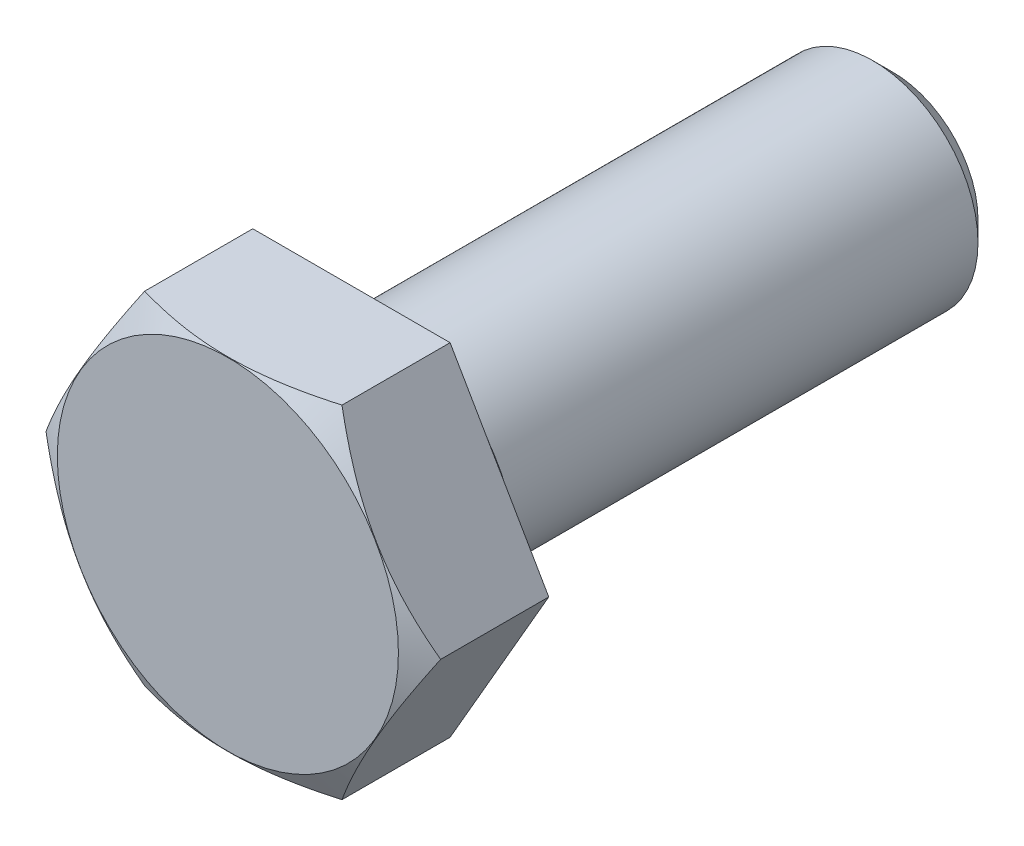
ISO-10303-21;
HEADER;
FILE_DESCRIPTION(('STEP AP214'),'2;1');
FILE_NAME('part.step','',(''),(''),'','','');
FILE_SCHEMA(('AUTOMOTIVE_DESIGN { 1 0 10303 214 1 1 1 1 }'));
ENDSEC;
DATA;
#1=APPLICATION_CONTEXT('core data for automotive mechanical design processes');
#2=APPLICATION_PROTOCOL_DEFINITION('international standard','automotive_design',2000,#1);
#3=PRODUCT_CONTEXT('',#1,'mechanical');
#4=PRODUCT('Part','Part','',(#3));
#5=PRODUCT_RELATED_PRODUCT_CATEGORY('part','',(#4));
#6=PRODUCT_DEFINITION_FORMATION('','',#4);
#7=PRODUCT_DEFINITION_CONTEXT('part definition',#1,'design');
#8=PRODUCT_DEFINITION('design','',#6,#7);
#9=PRODUCT_DEFINITION_SHAPE('','',#8);
#10=(LENGTH_UNIT() NAMED_UNIT(*) SI_UNIT(.MILLI.,.METRE.));
#11=(NAMED_UNIT(*) PLANE_ANGLE_UNIT() SI_UNIT($,.RADIAN.));
#12=(NAMED_UNIT(*) SI_UNIT($,.STERADIAN.) SOLID_ANGLE_UNIT());
#13=UNCERTAINTY_MEASURE_WITH_UNIT(LENGTH_MEASURE(1.E-05),#10,'distance_accuracy_value','');
#14=(GEOMETRIC_REPRESENTATION_CONTEXT(3) GLOBAL_UNCERTAINTY_ASSIGNED_CONTEXT((#13)) GLOBAL_UNIT_ASSIGNED_CONTEXT((#10,
#11,#12)) REPRESENTATION_CONTEXT('',''));
#15=CARTESIAN_POINT('',(0.,0.,0.));
#16=DIRECTION('',(0.,0.,1.));
#17=DIRECTION('',(1.,0.,0.));
#18=AXIS2_PLACEMENT_3D('',#15,#16,#17);
#19=CARTESIAN_POINT('',(0.,0.,-20.));
#20=DIRECTION('',(0.,0.,1.));
#21=DIRECTION('',(1.,0.,0.));
#22=AXIS2_PLACEMENT_3D('',#19,#20,#21);
#23=PLANE('',#22);
#24=CARTESIAN_POINT('',(0.,0.,-20.));
#25=DIRECTION('',(0.,0.,1.));
#26=DIRECTION('',(1.,0.,0.));
#27=AXIS2_PLACEMENT_3D('',#24,#25,#26);
#28=CIRCLE('',#27,3.23300000000001);
#29=CARTESIAN_POINT('',(3.23300000000001,0.,-20.));
#30=VERTEX_POINT('',#29);
#31=EDGE_CURVE('E483',#30,#30,#28,.F.);
#32=ORIENTED_EDGE('',*,*,#31,.T.);
#33=EDGE_LOOP('',(#32));
#34=FACE_BOUND('',#33,.T.);
#35=ADVANCED_FACE('F15',(#34),#23,.F.);
#36=CARTESIAN_POINT('',(0.,0.,6.4));
#37=DIRECTION('',(0.,0.,1.));
#38=DIRECTION('',(1.,0.,0.));
#39=AXIS2_PLACEMENT_3D('',#36,#37,#38);
#40=CYLINDRICAL_SURFACE('',#39,4.00000000000001);
#41=CARTESIAN_POINT('',(0.,0.,-19.233));
#42=DIRECTION('',(0.,0.,1.));
#43=DIRECTION('',(1.,0.,0.));
#44=AXIS2_PLACEMENT_3D('',#41,#42,#43);
#45=CIRCLE('',#44,4.00000000000001);
#46=CARTESIAN_POINT('',(4.00000000000001,0.,-19.233));
#47=VERTEX_POINT('',#46);
#48=EDGE_CURVE('E72',#47,#47,#45,.T.);
#49=ORIENTED_EDGE('',*,*,#48,.T.);
#50=EDGE_LOOP('',(#49));
#51=FACE_BOUND('',#50,.T.);
#52=CARTESIAN_POINT('',(0.,0.,-1.237));
#53=DIRECTION('',(0.,0.,1.));
#54=DIRECTION('',(1.,0.,0.));
#55=AXIS2_PLACEMENT_3D('',#52,#53,#54);
#56=CIRCLE('',#55,4.00000000000001);
#57=CARTESIAN_POINT('',(4.,0.,-1.237));
#58=VERTEX_POINT('',#57);
#59=EDGE_CURVE('E96',#58,#58,#56,.T.);
#60=ORIENTED_EDGE('',*,*,#59,.F.);
#61=EDGE_LOOP('',(#60));
#62=FACE_BOUND('',#61,.T.);
#63=ADVANCED_FACE('F171',(#51,#62),#40,.T.);
#64=CARTESIAN_POINT('',(0.,0.,-1.237));
#65=DIRECTION('',(0.,0.,-1.));
#66=DIRECTION('',(-1.,0.,0.));
#67=AXIS2_PLACEMENT_3D('',#64,#65,#66);
#68=CONICAL_SURFACE('',#67,4.00000000000001,0.463647609000808);
#69=CARTESIAN_POINT('',(0.,0.,-0.425000000000003));
#70=DIRECTION('',(0.,0.,1.));
#71=DIRECTION('',(1.,0.,0.));
#72=AXIS2_PLACEMENT_3D('',#69,#70,#71);
#73=CIRCLE('',#72,3.59400000000001);
#74=CARTESIAN_POINT('',(3.594,0.,-0.425000000000001));
#75=VERTEX_POINT('',#74);
#76=EDGE_CURVE('E88',#75,#75,#73,.T.);
#77=ORIENTED_EDGE('',*,*,#76,.F.);
#78=EDGE_LOOP('',(#77));
#79=FACE_BOUND('',#78,.T.);
#80=ORIENTED_EDGE('',*,*,#59,.T.);
#81=EDGE_LOOP('',(#80));
#82=FACE_BOUND('',#81,.T.);
#83=ADVANCED_FACE('F177',(#79,#82),#68,.T.);
#84=CARTESIAN_POINT('',(0.,0.,6.4));
#85=DIRECTION('',(0.,0.,1.));
#86=DIRECTION('',(1.,0.,0.));
#87=AXIS2_PLACEMENT_3D('',#84,#85,#86);
#88=CYLINDRICAL_SURFACE('',#87,3.59400000000001);
#89=CARTESIAN_POINT('',(0.,0.,-0.400000000000002));
#90=DIRECTION('',(0.,0.,1.));
#91=DIRECTION('',(1.,0.,0.));
#92=AXIS2_PLACEMENT_3D('',#89,#90,#91);
#93=CIRCLE('',#92,3.59400000000001);
#94=CARTESIAN_POINT('',(3.594,0.,-0.4));
#95=VERTEX_POINT('',#94);
#96=EDGE_CURVE('E205',#95,#95,#93,.F.);
#97=ORIENTED_EDGE('',*,*,#96,.T.);
#98=EDGE_LOOP('',(#97));
#99=FACE_BOUND('',#98,.T.);
#100=ORIENTED_EDGE('',*,*,#76,.T.);
#101=EDGE_LOOP('',(#100));
#102=FACE_BOUND('',#101,.T.);
#103=ADVANCED_FACE('F267',(#99,#102),#88,.T.);
#104=CARTESIAN_POINT('',(3.594,0.,0.));
#105=DIRECTION('',(0.,0.,1.));
#106=DIRECTION('',(1.,0.,0.));
#107=AXIS2_PLACEMENT_3D('',#104,#105,#106);
#108=PLANE('',#107);
#109=CARTESIAN_POINT('',(0.,0.,0.));
#110=DIRECTION('',(0.,0.,1.));
#111=DIRECTION('',(1.,0.,0.));
#112=AXIS2_PLACEMENT_3D('',#109,#110,#111);
#113=CIRCLE('',#112,5.665);
#114=CARTESIAN_POINT('',(5.665,0.,0.));
#115=VERTEX_POINT('',#114);
#116=EDGE_CURVE('E200',#115,#115,#113,.F.);
#117=ORIENTED_EDGE('',*,*,#116,.T.);
#118=EDGE_LOOP('',(#117));
#119=FACE_BOUND('',#118,.T.);
#120=CARTESIAN_POINT('',(0.,0.,0.));
#121=DIRECTION('',(0.,0.,1.));
#122=DIRECTION('',(1.,0.,0.));
#123=AXIS2_PLACEMENT_3D('',#120,#121,#122);
#124=CIRCLE('',#123,3.99400000000001);
#125=CARTESIAN_POINT('',(3.994,0.,0.));
#126=VERTEX_POINT('',#125);
#127=EDGE_CURVE('E209',#126,#126,#124,.T.);
#128=ORIENTED_EDGE('',*,*,#127,.T.);
#129=EDGE_LOOP('',(#128));
#130=FACE_BOUND('',#129,.T.);
#131=ADVANCED_FACE('F219',(#119,#130),#108,.F.);
#132=CARTESIAN_POINT('',(5.815,0.,0.6));
#133=DIRECTION('',(0.,0.,1.));
#134=DIRECTION('',(1.,0.,0.));
#135=AXIS2_PLACEMENT_3D('',#132,#133,#134);
#136=PLANE('',#135);
#137=CARTESIAN_POINT('',(0.,0.,0.600000000000002));
#138=DIRECTION('',(0.,0.,1.));
#139=DIRECTION('',(1.,0.,0.));
#140=AXIS2_PLACEMENT_3D('',#137,#138,#139);
#141=CIRCLE('',#140,6.2625);
#142=CARTESIAN_POINT('',(6.2625,0.,0.6));
#143=VERTEX_POINT('',#142);
#144=EDGE_CURVE('E23',#143,#143,#141,.T.);
#145=ORIENTED_EDGE('',*,*,#144,.T.);
#146=EDGE_LOOP('',(#145));
#147=FACE_BOUND('',#146,.T.);
#148=DIRECTION('',(-0.5,0.866025403784439,0.));
#149=VECTOR('',#148,1.);
#150=CARTESIAN_POINT('',(7.50555349946514,0.,0.599999999999999));
#151=LINE('',#150,#149);
#152=CARTESIAN_POINT('',(7.50555349946514,0.,0.6));
#153=VERTEX_POINT('',#152);
#154=CARTESIAN_POINT('',(3.75277674973257,6.50000000000001,0.600000000000001));
#155=VERTEX_POINT('',#154);
#156=EDGE_CURVE('E86',#153,#155,#151,.T.);
#157=ORIENTED_EDGE('',*,*,#156,.F.);
#158=DIRECTION('',(0.500000000000001,0.866025403784438,0.));
#159=VECTOR('',#158,1.);
#160=CARTESIAN_POINT('',(3.75277674973256,-6.50000000000002,0.600000000000001));
#161=LINE('',#160,#159);
#162=CARTESIAN_POINT('',(3.75277674973256,-6.50000000000001,0.600000000000001));
#163=VERTEX_POINT('',#162);
#164=EDGE_CURVE('E73',#163,#153,#161,.T.);
#165=ORIENTED_EDGE('',*,*,#164,.F.);
#166=DIRECTION('',(1.,0.,0.));
#167=VECTOR('',#166,1.);
#168=CARTESIAN_POINT('',(-3.75277674973259,-6.50000000000001,0.600000000000003));
#169=LINE('',#168,#167);
#170=CARTESIAN_POINT('',(-3.75277674973259,-6.50000000000001,0.600000000000003));
#171=VERTEX_POINT('',#170);
#172=EDGE_CURVE('E241',#171,#163,#169,.T.);
#173=ORIENTED_EDGE('',*,*,#172,.F.);
#174=DIRECTION('',(0.5,-0.866025403784439,0.));
#175=VECTOR('',#174,1.);
#176=CARTESIAN_POINT('',(-7.50555349946516,0.,0.600000000000004));
#177=LINE('',#176,#175);
#178=CARTESIAN_POINT('',(-7.50555349946515,0.,0.600000000000004));
#179=VERTEX_POINT('',#178);
#180=EDGE_CURVE('E238',#179,#171,#177,.T.);
#181=ORIENTED_EDGE('',*,*,#180,.F.);
#182=DIRECTION('',(-0.5,-0.866025403784439,0.));
#183=VECTOR('',#182,1.);
#184=CARTESIAN_POINT('',(-3.75277674973258,6.50000000000001,0.600000000000003));
#185=LINE('',#184,#183);
#186=CARTESIAN_POINT('',(-3.75277674973258,6.50000000000001,0.600000000000003));
#187=VERTEX_POINT('',#186);
#188=EDGE_CURVE('E240',#187,#179,#185,.T.);
#189=ORIENTED_EDGE('',*,*,#188,.F.);
#190=DIRECTION('',(-1.,0.,0.));
#191=VECTOR('',#190,1.);
#192=CARTESIAN_POINT('',(3.75277674973256,6.50000000000001,0.600000000000001));
#193=LINE('',#192,#191);
#194=EDGE_CURVE('E224',#155,#187,#193,.T.);
#195=ORIENTED_EDGE('',*,*,#194,.F.);
#196=EDGE_LOOP('',(#157,#165,#173,#181,#189,#195));
#197=FACE_BOUND('',#196,.T.);
#198=ADVANCED_FACE('F115',(#147,#197),#136,.F.);
#199=CARTESIAN_POINT('',(0.,0.,6.4));
#200=DIRECTION('',(0.,0.,1.));
#201=DIRECTION('',(1.,0.,0.));
#202=AXIS2_PLACEMENT_3D('',#199,#200,#201);
#203=CYLINDRICAL_SURFACE('',#202,5.815);
#204=CARTESIAN_POINT('',(0.,0.,0.152500000000002));
#205=DIRECTION('',(0.,0.,1.));
#206=DIRECTION('',(1.,0.,0.));
#207=AXIS2_PLACEMENT_3D('',#204,#205,#206);
#208=CIRCLE('',#207,5.815);
#209=CARTESIAN_POINT('',(5.815,0.,0.1525));
#210=VERTEX_POINT('',#209);
#211=EDGE_CURVE('E9',#210,#210,#208,.F.);
#212=ORIENTED_EDGE('',*,*,#211,.T.);
#213=EDGE_LOOP('',(#212));
#214=FACE_BOUND('',#213,.T.);
#215=CARTESIAN_POINT('',(0.,0.,0.149999999999998));
#216=DIRECTION('',(0.,0.,1.));
#217=DIRECTION('',(1.,0.,0.));
#218=AXIS2_PLACEMENT_3D('',#215,#216,#217);
#219=CIRCLE('',#218,5.815);
#220=CARTESIAN_POINT('',(5.815,0.,0.150000000000001));
#221=VERTEX_POINT('',#220);
#222=EDGE_CURVE('E203',#221,#221,#219,.T.);
#223=ORIENTED_EDGE('',*,*,#222,.T.);
#224=EDGE_LOOP('',(#223));
#225=FACE_BOUND('',#224,.T.);
#226=ADVANCED_FACE('F218',(#214,#225),#203,.T.);
#227=CARTESIAN_POINT('',(3.75277674973256,-6.50000000000001,5.3));
#228=DIRECTION('',(-0.866025403784438,0.500000000000001,0.));
#229=DIRECTION('',(-0.500000000000001,-0.866025403784438,0.));
#230=AXIS2_PLACEMENT_3D('',#227,#228,#229);
#231=PLANE('',#230);
#232=DIRECTION('',(0.,0.,-1.));
#233=VECTOR('',#232,1.);
#234=CARTESIAN_POINT('',(7.50555349946514,0.,5.3));
#235=LINE('',#234,#233);
#236=CARTESIAN_POINT('',(7.50555349946514,0.,4.71222653803436));
#237=VERTEX_POINT('',#236);
#238=EDGE_CURVE('E37',#237,#153,#235,.T.);
#239=ORIENTED_EDGE('',*,*,#238,.F.);
#240=CARTESIAN_POINT('',(7.50566896951897,0.00019999999998544,4.71215986982926));
#241=CARTESIAN_POINT('',(7.4231786300702,-0.142677459058894,4.75977869855964));
#242=CARTESIAN_POINT('',(7.34038072665458,-0.286087634534927,4.80523642103242));
#243=CARTESIAN_POINT('',(7.17411251123976,-0.574072631317209,4.89123443961208));
#244=CARTESIAN_POINT('',(7.09064192560665,-0.718647926571278,4.9317726144071));
#245=CARTESIAN_POINT('',(6.83889369625719,-1.15468865052005,5.04521212051192));
#246=CARTESIAN_POINT('',(6.66962231516081,-1.44787528284633,5.10973531450639));
#247=CARTESIAN_POINT('',(6.41631077211555,-1.88662374554439,5.18539653808764));
#248=CARTESIAN_POINT('',(6.33302748139454,-2.03087463649471,5.20695026517814));
#249=CARTESIAN_POINT('',(6.16608458377293,-2.3200282171381,5.24309280702901));
#250=CARTESIAN_POINT('',(6.08242501078143,-2.4649308480989,5.25768223717546));
#251=CARTESIAN_POINT('',(5.91496056339806,-2.75498777942834,5.27952436912778));
#252=CARTESIAN_POINT('',(5.8311559625217,-2.90014160605423,5.28678539731302));
#253=CARTESIAN_POINT('',(5.66347396979286,-3.19057533697497,5.2938228190529));
#254=CARTESIAN_POINT('',(5.5795965802691,-3.33585523723637,5.29359944382292));
#255=CARTESIAN_POINT('',(5.34979921898453,-3.73387594242651,5.28269966311996));
#256=CARTESIAN_POINT('',(5.20395446807006,-3.98648646102759,5.26440130376571));
#257=CARTESIAN_POINT('',(4.91323365606635,-4.4900296782357,5.20637678017745));
#258=CARTESIAN_POINT('',(4.76835861741225,-4.7409606059331,5.16663078309688));
#259=CARTESIAN_POINT('',(4.47705272008731,-5.24551722064434,5.06727721843298));
#260=CARTESIAN_POINT('',(4.33065861912702,-5.49907924143593,5.0072486959971));
#261=CARTESIAN_POINT('',(4.04005357906493,-6.00242193575906,4.87100812912525));
#262=CARTESIAN_POINT('',(3.89583891821181,-6.25220905555298,4.79482808747153));
#263=CARTESIAN_POINT('',(3.75266127967872,-6.50020000000001,4.71215986982925));
#264=B_SPLINE_CURVE_WITH_KNOTS('',3,(#240,#241,#242,#243,#244,#245,#246,#247,#248,#249,#250,
#251,#252,#253,#254,#255,#256,#257,#258,#259,#260,#261,#262,#263),.UNSPECIFIED.,.F.,.F.,(4,2,2,
2,2,2,2,2,2,2,2,4),(0.,0.515105052395587,1.03043143507525,2.06322554824262,2.56697389547997,
3.07067772176454,3.57380860368928,4.0769239424252,4.9527935470566,5.82947446853467,
6.72559912449737,7.61996451221046),.UNSPECIFIED.);
#265=CARTESIAN_POINT('',(3.75277674973254,-6.50000000000002,4.71222653803436));
#266=VERTEX_POINT('',#265);
#267=EDGE_CURVE('E30',#237,#266,#264,.T.);
#268=ORIENTED_EDGE('',*,*,#267,.T.);
#269=DIRECTION('',(0.,0.,-1.));
#270=VECTOR('',#269,1.);
#271=CARTESIAN_POINT('',(3.75277674973254,-6.50000000000002,5.3));
#272=LINE('',#271,#270);
#273=EDGE_CURVE('E225',#266,#163,#272,.T.);
#274=ORIENTED_EDGE('',*,*,#273,.T.);
#275=ORIENTED_EDGE('',*,*,#164,.T.);
#276=EDGE_LOOP('',(#239,#268,#274,#275));
#277=FACE_BOUND('',#276,.T.);
#278=ADVANCED_FACE('F154',(#277),#231,.F.);
#279=CARTESIAN_POINT('',(-3.75277674973259,-6.50000000000001,5.3));
#280=DIRECTION('',(0.,1.,0.));
#281=DIRECTION('',(-1.,0.,0.));
#282=AXIS2_PLACEMENT_3D('',#279,#280,#281);
#283=PLANE('',#282);
#284=ORIENTED_EDGE('',*,*,#273,.F.);
#285=CARTESIAN_POINT('',(-9.95192223447463,-6.5,2.18284038705658));
#286=CARTESIAN_POINT('',(-9.66654322355623,-6.5,2.32074715821217));
#287=CARTESIAN_POINT('',(-9.38048936778979,-6.5,2.4572827164443));
#288=CARTESIAN_POINT('',(-8.80666707821768,-6.5,2.7268278269567));
#289=CARTESIAN_POINT('',(-8.51889835787184,-6.5,2.85983676851386));
#290=CARTESIAN_POINT('',(-7.93972645626618,-6.5,3.12224598105));
#291=CARTESIAN_POINT('',(-7.64831189971321,-6.5,3.25162123589858));
#292=CARTESIAN_POINT('',(-7.06308723103766,-6.5,3.50481332691721));
#293=CARTESIAN_POINT('',(-6.76927724476697,-6.5,3.62863045290667));
#294=CARTESIAN_POINT('',(-6.17515170820028,-6.50000000000001,3.87069633717444));
#295=CARTESIAN_POINT('',(-5.87480056230837,-6.50000000000001,3.98885820743647));
#296=CARTESIAN_POINT('',(-5.27055501966765,-6.50000000000001,4.21592498692658));
#297=CARTESIAN_POINT('',(-4.96666023292661,-6.50000000000001,4.32482886612941));
#298=CARTESIAN_POINT('',(-4.35546950815871,-6.50000000000001,4.53045302209049));
#299=CARTESIAN_POINT('',(-4.04818237572925,-6.50000000000001,4.62719920978131));
#300=CARTESIAN_POINT('',(-3.42923648938626,-6.50000000000001,4.80536420912367));
#301=CARTESIAN_POINT('',(-3.11757915186356,-6.50000000000001,4.88678786885479));
#302=CARTESIAN_POINT('',(-2.48969459073068,-6.50000000000001,5.03035856720055));
#303=CARTESIAN_POINT('',(-2.17346616167562,-6.50000000000001,5.09250042022912));
#304=CARTESIAN_POINT('',(-1.53715350192612,-6.50000000000001,5.19330706622955));
#305=CARTESIAN_POINT('',(-1.21706926764248,-6.50000000000001,5.23197183734588));
#306=CARTESIAN_POINT('',(-0.736434140476614,-6.50000000000001,5.26988255668119));
#307=CARTESIAN_POINT('',(-0.576634978150687,-6.50000000000001,5.279173678655));
#308=CARTESIAN_POINT('',(-0.256779253820426,-6.50000000000001,5.2909847052958));
#309=CARTESIAN_POINT('',(-0.0967226951815883,-6.50000000000001,5.29350469778756));
#310=CARTESIAN_POINT('',(0.223305688666705,-6.50000000000001,5.2917057450086));
#311=CARTESIAN_POINT('',(0.383277525050616,-6.50000000000001,5.28738871783858));
#312=CARTESIAN_POINT('',(0.702900352444858,-6.50000000000001,5.27202510081838));
#313=CARTESIAN_POINT('',(0.862551327051667,-6.50000000000001,5.2609781752735));
#314=CARTESIAN_POINT('',(1.24952795555346,-6.50000000000001,5.22627493697242));
#315=CARTESIAN_POINT('',(1.47655593672216,-6.50000000000002,5.19924465370986));
#316=CARTESIAN_POINT('',(1.92887159219138,-6.50000000000002,5.13307499664899));
#317=CARTESIAN_POINT('',(2.15415877413765,-6.50000000000002,5.09393231694072));
#318=CARTESIAN_POINT('',(2.60280712008155,-6.50000000000002,5.00492607704901));
#319=CARTESIAN_POINT('',(2.82616625333593,-6.50000000000002,4.95505237773796));
#320=CARTESIAN_POINT('',(3.2705861615033,-6.50000000000002,4.84610576455041));
#321=CARTESIAN_POINT('',(3.49164715087111,-6.50000000000002,4.78703371740283));
#322=CARTESIAN_POINT('',(3.93691407314137,-6.50000000000002,4.6595598332919));
#323=CARTESIAN_POINT('',(4.16106432602393,-6.50000000000002,4.59096484159923));
#324=CARTESIAN_POINT('',(4.60699553740924,-6.50000000000002,4.44699939741888));
#325=CARTESIAN_POINT('',(4.82877801391963,-6.50000000000002,4.37163361903417));
#326=CARTESIAN_POINT('',(5.26908372047681,-6.50000000000002,4.21568317743051));
#327=CARTESIAN_POINT('',(5.48761826971996,-6.50000000000002,4.13513028106189));
#328=CARTESIAN_POINT('',(5.92299202358665,-6.50000000000002,3.96929786021068));
#329=CARTESIAN_POINT('',(6.13983050168875,-6.50000000000002,3.88401642454735));
#330=CARTESIAN_POINT('',(6.35588132294957,-6.50000000000002,3.79683852258762));
#331=B_SPLINE_CURVE_WITH_KNOTS('',3,(#285,#286,#287,#288,#289,#290,#291,#292,#293,#294,#295,
#296,#297,#298,#299,#300,#301,#302,#303,#304,#305,#306,#307,#308,#309,#310,#311,#312,#313,#314,
#315,#316,#317,#318,#319,#320,#321,#322,#323,#324,#325,#326,#327,#328,#329,#330),.UNSPECIFIED.,
.F.,.F.,(4,2,2,2,2,2,2,2,2,2,2,2,2,2,2,2,2,2,2,2,2,2,4),(0.,0.95087297107705,1.90190954841196,
2.8583902616015,3.8148210426184,4.78297868464377,5.75124390133097,6.71740919517679,
7.68326827643809,8.64938688799503,9.61550639894061,10.0955916388198,10.5756706517357,
11.0556150041076,11.5355832985889,12.2210957546106,12.9067954769872,13.5931459454014,
14.2794317804451,14.982535124568,15.6851567686087,16.3838231545437,17.0827740156058),.UNSPECIFIED.);
#332=CARTESIAN_POINT('',(-3.75277674973259,-6.5,4.71222653803436));
#333=VERTEX_POINT('',#332);
#334=EDGE_CURVE('E139',#266,#333,#331,.F.);
#335=ORIENTED_EDGE('',*,*,#334,.T.);
#336=DIRECTION('',(0.,0.,-1.));
#337=VECTOR('',#336,1.);
#338=CARTESIAN_POINT('',(-3.75277674973259,-6.5,5.3));
#339=LINE('',#338,#337);
#340=EDGE_CURVE('E229',#333,#171,#339,.T.);
#341=ORIENTED_EDGE('',*,*,#340,.T.);
#342=ORIENTED_EDGE('',*,*,#172,.T.);
#343=EDGE_LOOP('',(#284,#335,#341,#342));
#344=FACE_BOUND('',#343,.T.);
#345=ADVANCED_FACE('F150',(#344),#283,.F.);
#346=CARTESIAN_POINT('',(-7.50555349946516,0.,5.29999999999999));
#347=DIRECTION('',(0.866025403784439,0.5,0.));
#348=DIRECTION('',(-0.5,0.866025403784439,0.));
#349=AXIS2_PLACEMENT_3D('',#346,#347,#348);
#350=PLANE('',#349);
#351=ORIENTED_EDGE('',*,*,#340,.F.);
#352=CARTESIAN_POINT('',(-3.75266127967875,-6.5002,4.71215986982925));
#353=CARTESIAN_POINT('',(-3.83515161912753,-6.35732254094112,4.75977869855964));
#354=CARTESIAN_POINT('',(-3.91794952254315,-6.21391236546509,4.80523642103242));
#355=CARTESIAN_POINT('',(-4.08421773795797,-5.9259273686828,4.89123443961208));
#356=CARTESIAN_POINT('',(-4.16768832359108,-5.78135207342873,4.9317726144071));
#357=CARTESIAN_POINT('',(-4.41943655294054,-5.34531134947996,5.04521212051191));
#358=CARTESIAN_POINT('',(-4.58870793403692,-5.05212471715368,5.10973531450638));
#359=CARTESIAN_POINT('',(-4.84201947708218,-4.61337625445562,5.18539653808763));
#360=CARTESIAN_POINT('',(-4.92530276780319,-4.4691253635053,5.20695026517813));
#361=CARTESIAN_POINT('',(-5.0922456654248,-4.17997178286191,5.243092807029));
#362=CARTESIAN_POINT('',(-5.1759052384163,-4.0350691519011,5.25768223717545));
#363=CARTESIAN_POINT('',(-5.34336968579967,-3.74501222057167,5.27952436912777));
#364=CARTESIAN_POINT('',(-5.42717428667603,-3.59985839394578,5.28678539731301));
#365=CARTESIAN_POINT('',(-5.59485627940487,-3.30942466302504,5.29382281905289));
#366=CARTESIAN_POINT('',(-5.67873366892863,-3.16414476276363,5.29359944382292));
#367=CARTESIAN_POINT('',(-5.9085310302132,-2.7661240575735,5.28269966311995));
#368=CARTESIAN_POINT('',(-6.05437578112766,-2.51351353897242,5.26440130376571));
#369=CARTESIAN_POINT('',(-6.34509659313137,-2.00997032176432,5.20637678017744));
#370=CARTESIAN_POINT('',(-6.48997163178547,-1.75903939406691,5.16663078309687));
#371=CARTESIAN_POINT('',(-6.78127752911041,-1.25448277935567,5.06727721843297));
#372=CARTESIAN_POINT('',(-6.9276716300707,-1.00092075856408,5.00724869599709));
#373=CARTESIAN_POINT('',(-7.21827667013279,-0.497578064240955,4.87100812912525));
#374=CARTESIAN_POINT('',(-7.36249133098591,-0.247790944447037,4.79482808747152));
#375=CARTESIAN_POINT('',(-7.505668969519,0.000199999999998474,4.71215986982925));
#376=B_SPLINE_CURVE_WITH_KNOTS('',3,(#352,#353,#354,#355,#356,#357,#358,#359,#360,#361,#362,
#363,#364,#365,#366,#367,#368,#369,#370,#371,#372,#373,#374,#375),.UNSPECIFIED.,.F.,.F.,(4,2,2,
2,2,2,2,2,2,2,2,4),(0.,0.515105052395589,1.03043143507525,2.06322554824263,2.56697389547997,
3.07067772176455,3.57380860368929,4.07692394242521,4.95279354705661,5.82947446853467,
6.72559912449736,7.61996451221046),.UNSPECIFIED.);
#377=CARTESIAN_POINT('',(-7.50555349946515,0.,4.71222653803436));
#378=VERTEX_POINT('',#377);
#379=EDGE_CURVE('E133',#333,#378,#376,.T.);
#380=ORIENTED_EDGE('',*,*,#379,.T.);
#381=DIRECTION('',(0.,0.,-1.));
#382=VECTOR('',#381,1.);
#383=CARTESIAN_POINT('',(-7.50555349946515,0.,5.3));
#384=LINE('',#383,#382);
#385=EDGE_CURVE('E90',#378,#179,#384,.T.);
#386=ORIENTED_EDGE('',*,*,#385,.T.);
#387=ORIENTED_EDGE('',*,*,#180,.T.);
#388=EDGE_LOOP('',(#351,#380,#386,#387));
#389=FACE_BOUND('',#388,.T.);
#390=ADVANCED_FACE('F153',(#389),#350,.F.);
#391=CARTESIAN_POINT('',(-3.75277674973258,6.50000000000001,5.29999999999999));
#392=DIRECTION('',(0.866025403784439,-0.5,0.));
#393=DIRECTION('',(0.5,0.866025403784439,0.));
#394=AXIS2_PLACEMENT_3D('',#391,#392,#393);
#395=PLANE('',#394);
#396=ORIENTED_EDGE('',*,*,#385,.F.);
#397=CARTESIAN_POINT('',(-7.50566896951899,-0.000199999999989351,4.71215986982925));
#398=CARTESIAN_POINT('',(-7.42317863007022,0.142677459058891,4.75977869855963));
#399=CARTESIAN_POINT('',(-7.3403807266546,0.286087634534925,4.80523642103241));
#400=CARTESIAN_POINT('',(-7.17411251123977,0.574072631317208,4.89123443961207));
#401=CARTESIAN_POINT('',(-7.09064192560667,0.718647926571278,4.9317726144071));
#402=CARTESIAN_POINT('',(-6.8388936962572,1.15468865052005,5.04521212051191));
#403=CARTESIAN_POINT('',(-6.66962231516082,1.44787528284634,5.10973531450638));
#404=CARTESIAN_POINT('',(-6.41631077211556,1.88662374554439,5.18539653808763));
#405=CARTESIAN_POINT('',(-6.33302748139455,2.03087463649471,5.20695026517813));
#406=CARTESIAN_POINT('',(-6.16608458377294,2.32002821713811,5.243092807029));
#407=CARTESIAN_POINT('',(-6.08242501078144,2.46493084809891,5.25768223717546));
#408=CARTESIAN_POINT('',(-5.91496056339808,2.75498777942834,5.27952436912777));
#409=CARTESIAN_POINT('',(-5.83115596252171,2.90014160605423,5.28678539731301));
#410=CARTESIAN_POINT('',(-5.66347396979288,3.19057533697497,5.29382281905289));
#411=CARTESIAN_POINT('',(-5.57959658026911,3.33585523723638,5.29359944382292));
#412=CARTESIAN_POINT('',(-5.34979921898454,3.73387594242652,5.28269966311995));
#413=CARTESIAN_POINT('',(-5.20395446807008,3.98648646102759,5.26440130376571));
#414=CARTESIAN_POINT('',(-4.91323365606637,4.4900296782357,5.20637678017744));
#415=CARTESIAN_POINT('',(-4.76835861741227,4.7409606059331,5.16663078309687));
#416=CARTESIAN_POINT('',(-4.47705272008733,5.24551722064434,5.06727721843297));
#417=CARTESIAN_POINT('',(-4.33065861912704,5.49907924143593,5.00724869599709));
#418=CARTESIAN_POINT('',(-4.04005357906495,6.00242193575906,4.87100812912525));
#419=CARTESIAN_POINT('',(-3.89583891821183,6.25220905555298,4.79482808747153));
#420=CARTESIAN_POINT('',(-3.75266127967875,6.50020000000001,4.71215986982925));
#421=B_SPLINE_CURVE_WITH_KNOTS('',3,(#397,#398,#399,#400,#401,#402,#403,#404,#405,#406,#407,
#408,#409,#410,#411,#412,#413,#414,#415,#416,#417,#418,#419,#420),.UNSPECIFIED.,.F.,.F.,(4,2,2,
2,2,2,2,2,2,2,2,4),(0.,0.51510505239559,1.03043143507525,2.06322554824263,2.56697389547997,
3.07067772176455,3.57380860368929,4.07692394242522,4.95279354705661,5.82947446853467,
6.72559912449737,7.61996451221046),.UNSPECIFIED.);
#422=CARTESIAN_POINT('',(-3.75277674973257,6.50000000000001,4.71222653803436));
#423=VERTEX_POINT('',#422);
#424=EDGE_CURVE('E82',#378,#423,#421,.T.);
#425=ORIENTED_EDGE('',*,*,#424,.T.);
#426=DIRECTION('',(0.,0.,-1.));
#427=VECTOR('',#426,1.);
#428=CARTESIAN_POINT('',(-3.75277674973257,6.50000000000001,5.3));
#429=LINE('',#428,#427);
#430=EDGE_CURVE('E81',#423,#187,#429,.T.);
#431=ORIENTED_EDGE('',*,*,#430,.T.);
#432=ORIENTED_EDGE('',*,*,#188,.T.);
#433=EDGE_LOOP('',(#396,#425,#431,#432));
#434=FACE_BOUND('',#433,.T.);
#435=ADVANCED_FACE('F159',(#434),#395,.F.);
#436=CARTESIAN_POINT('',(3.75277674973256,6.50000000000001,5.3));
#437=DIRECTION('',(0.,-1.,0.));
#438=DIRECTION('',(0.,0.,-1.));
#439=AXIS2_PLACEMENT_3D('',#436,#437,#438);
#440=PLANE('',#439);
#441=ORIENTED_EDGE('',*,*,#430,.F.);
#442=CARTESIAN_POINT('',(-9.95192223447485,6.50000000000001,2.18284038705647));
#443=CARTESIAN_POINT('',(-9.66654322355646,6.50000000000001,2.32074715821206));
#444=CARTESIAN_POINT('',(-9.38048936779002,6.50000000000001,2.45728271644419));
#445=CARTESIAN_POINT('',(-8.8066670782179,6.50000000000001,2.72682782695659));
#446=CARTESIAN_POINT('',(-8.51889835787206,6.50000000000001,2.85983676851375));
#447=CARTESIAN_POINT('',(-7.9397264562664,6.50000000000001,3.1222459810499));
#448=CARTESIAN_POINT('',(-7.64831189971343,6.50000000000001,3.25162123589848));
#449=CARTESIAN_POINT('',(-7.06308723103788,6.50000000000001,3.50481332691711));
#450=CARTESIAN_POINT('',(-6.76927724476719,6.50000000000001,3.62863045290658));
#451=CARTESIAN_POINT('',(-6.1751517082005,6.50000000000001,3.87069633717435));
#452=CARTESIAN_POINT('',(-5.87480056230859,6.50000000000001,3.98885820743638));
#453=CARTESIAN_POINT('',(-5.27055501966786,6.50000000000001,4.2159249869265));
#454=CARTESIAN_POINT('',(-4.96666023292682,6.50000000000001,4.32482886612933));
#455=CARTESIAN_POINT('',(-4.35546950815891,6.50000000000001,4.53045302209042));
#456=CARTESIAN_POINT('',(-4.04818237572946,6.50000000000001,4.62719920978125));
#457=CARTESIAN_POINT('',(-3.42923648938647,6.50000000000001,4.80536420912361));
#458=CARTESIAN_POINT('',(-3.11757915186376,6.50000000000001,4.88678786885474));
#459=CARTESIAN_POINT('',(-2.48969459073088,6.50000000000001,5.03035856720051));
#460=CARTESIAN_POINT('',(-2.17346616167582,6.50000000000001,5.09250042022908));
#461=CARTESIAN_POINT('',(-1.53715350192632,6.50000000000001,5.19330706622953));
#462=CARTESIAN_POINT('',(-1.21706926764267,6.50000000000001,5.23197183734586));
#463=CARTESIAN_POINT('',(-0.736434140476808,6.50000000000001,5.26988255668118));
#464=CARTESIAN_POINT('',(-0.57663497815088,6.50000000000001,5.27917367865499));
#465=CARTESIAN_POINT('',(-0.256779253820618,6.50000000000001,5.2909847052958));
#466=CARTESIAN_POINT('',(-0.0967226951817804,6.50000000000001,5.29350469778756));
#467=CARTESIAN_POINT('',(0.223305688666515,6.50000000000001,5.2917057450086));
#468=CARTESIAN_POINT('',(0.383277525050426,6.50000000000001,5.28738871783859));
#469=CARTESIAN_POINT('',(0.70290035244467,6.50000000000001,5.27202510081839));
#470=CARTESIAN_POINT('',(0.86255132705148,6.50000000000001,5.26097817527352));
#471=CARTESIAN_POINT('',(1.24952795555326,6.50000000000001,5.22627493697245));
#472=CARTESIAN_POINT('',(1.47655593672196,6.50000000000001,5.19924465370988));
#473=CARTESIAN_POINT('',(1.92887159219117,6.50000000000001,5.13307499664902));
#474=CARTESIAN_POINT('',(2.15415877413744,6.50000000000001,5.09393231694076));
#475=CARTESIAN_POINT('',(2.60280712008132,6.50000000000001,5.00492607704906));
#476=CARTESIAN_POINT('',(2.82616625333569,6.50000000000001,4.95505237773802));
#477=CARTESIAN_POINT('',(3.27058616150305,6.50000000000001,4.84610576455048));
#478=CARTESIAN_POINT('',(3.49164715087086,6.50000000000001,4.78703371740291));
#479=CARTESIAN_POINT('',(3.93691407314111,6.50000000000001,4.65955983329198));
#480=CARTESIAN_POINT('',(4.16106432602366,6.50000000000001,4.59096484159931));
#481=CARTESIAN_POINT('',(4.60699553740896,6.50000000000001,4.44699939741897));
#482=CARTESIAN_POINT('',(4.82877801391934,6.50000000000001,4.37163361903427));
#483=CARTESIAN_POINT('',(5.26908372047651,6.50000000000001,4.21568317743063));
#484=CARTESIAN_POINT('',(5.48761826971966,6.50000000000001,4.135130281062));
#485=CARTESIAN_POINT('',(5.92299202358633,6.50000000000001,3.9692978602108));
#486=CARTESIAN_POINT('',(6.13983050168843,6.50000000000001,3.88401642454748));
#487=CARTESIAN_POINT('',(6.35588132294924,6.50000000000001,3.79683852258775));
#488=B_SPLINE_CURVE_WITH_KNOTS('',3,(#442,#443,#444,#445,#446,#447,#448,#449,#450,#451,#452,
#453,#454,#455,#456,#457,#458,#459,#460,#461,#462,#463,#464,#465,#466,#467,#468,#469,#470,#471,
#472,#473,#474,#475,#476,#477,#478,#479,#480,#481,#482,#483,#484,#485,#486,#487),.UNSPECIFIED.,
.F.,.F.,(4,2,2,2,2,2,2,2,2,2,2,2,2,2,2,2,2,2,2,2,2,2,4),(0.,0.950872971077055,1.90190954841197,
2.85839026160151,3.81482104261842,4.78297868464379,5.751243901331,6.71740919517683,
7.68326827643813,8.64938688799508,9.61550639894067,10.0955916388199,10.5756706517358,
11.0556150041076,11.535583298589,12.2210957546106,12.9067954769872,13.5931459454014,
14.2794317804451,14.9825351245679,15.6851567686087,16.3838231545436,17.0827740156057),.UNSPECIFIED.);
#489=CARTESIAN_POINT('',(3.75277674973257,6.5,4.71222653803436));
#490=VERTEX_POINT('',#489);
#491=EDGE_CURVE('E69',#423,#490,#488,.T.);
#492=ORIENTED_EDGE('',*,*,#491,.T.);
#493=DIRECTION('',(0.,0.,-1.));
#494=VECTOR('',#493,1.);
#495=CARTESIAN_POINT('',(3.75277674973257,6.5,5.3));
#496=LINE('',#495,#494);
#497=EDGE_CURVE('E79',#490,#155,#496,.T.);
#498=ORIENTED_EDGE('',*,*,#497,.T.);
#499=ORIENTED_EDGE('',*,*,#194,.T.);
#500=EDGE_LOOP('',(#441,#492,#498,#499));
#501=FACE_BOUND('',#500,.T.);
#502=ADVANCED_FACE('F77',(#501),#440,.F.);
#503=CARTESIAN_POINT('',(7.50555349946514,0.,5.3));
#504=DIRECTION('',(-0.866025403784439,-0.5,0.));
#505=DIRECTION('',(0.5,-0.866025403784439,0.));
#506=AXIS2_PLACEMENT_3D('',#503,#504,#505);
#507=PLANE('',#506);
#508=ORIENTED_EDGE('',*,*,#497,.F.);
#509=CARTESIAN_POINT('',(3.75266127967873,6.5002,4.71215986982926));
#510=CARTESIAN_POINT('',(3.83515161912751,6.35732254094112,4.75977869855964));
#511=CARTESIAN_POINT('',(3.91794952254313,6.21391236546509,4.80523642103242));
#512=CARTESIAN_POINT('',(4.08421773795795,5.92592736868281,4.89123443961208));
#513=CARTESIAN_POINT('',(4.16768832359106,5.78135207342874,4.9317726144071));
#514=CARTESIAN_POINT('',(4.41943655294052,5.34531134947997,5.04521212051192));
#515=CARTESIAN_POINT('',(4.5887079340369,5.05212471715368,5.10973531450639));
#516=CARTESIAN_POINT('',(4.84201947708216,4.61337625445563,5.18539653808764));
#517=CARTESIAN_POINT('',(4.92530276780317,4.46912536350531,5.20695026517814));
#518=CARTESIAN_POINT('',(5.09224566542478,4.17997178286191,5.24309280702901));
#519=CARTESIAN_POINT('',(5.17590523841628,4.03506915190111,5.25768223717546));
#520=CARTESIAN_POINT('',(5.34336968579964,3.74501222057168,5.27952436912778));
#521=CARTESIAN_POINT('',(5.427174286676,3.59985839394579,5.28678539731302));
#522=CARTESIAN_POINT('',(5.59485627940484,3.30942466302505,5.2938228190529));
#523=CARTESIAN_POINT('',(5.67873366892861,3.16414476276364,5.29359944382292));
#524=CARTESIAN_POINT('',(5.90853103021318,2.7661240575735,5.28269966311996));
#525=CARTESIAN_POINT('',(6.05437578112764,2.51351353897243,5.26440130376572));
#526=CARTESIAN_POINT('',(6.34509659313135,2.00997032176432,5.20637678017745));
#527=CARTESIAN_POINT('',(6.48997163178545,1.75903939406692,5.16663078309688));
#528=CARTESIAN_POINT('',(6.78127752911039,1.25448277935568,5.06727721843298));
#529=CARTESIAN_POINT('',(6.92767163007068,1.00092075856409,5.0072486959971));
#530=CARTESIAN_POINT('',(7.21827667013277,0.497578064240956,4.87100812912526));
#531=CARTESIAN_POINT('',(7.36249133098589,0.247790944447037,4.79482808747153));
#532=CARTESIAN_POINT('',(7.50566896951898,-0.000199999999999051,4.71215986982926));
#533=B_SPLINE_CURVE_WITH_KNOTS('',3,(#509,#510,#511,#512,#513,#514,#515,#516,#517,#518,#519,
#520,#521,#522,#523,#524,#525,#526,#527,#528,#529,#530,#531,#532),.UNSPECIFIED.,.F.,.F.,(4,2,2,
2,2,2,2,2,2,2,2,4),(0.,0.515105052395588,1.03043143507524,2.06322554824262,2.56697389547997,
3.07067772176454,3.57380860368928,4.0769239424252,4.9527935470566,5.82947446853467,
6.72559912449736,7.61996451221046),.UNSPECIFIED.);
#534=EDGE_CURVE('E66',#490,#237,#533,.T.);
#535=ORIENTED_EDGE('',*,*,#534,.T.);
#536=ORIENTED_EDGE('',*,*,#238,.T.);
#537=ORIENTED_EDGE('',*,*,#156,.T.);
#538=EDGE_LOOP('',(#508,#535,#536,#537));
#539=FACE_BOUND('',#538,.T.);
#540=ADVANCED_FACE('F85',(#539),#507,.F.);
#541=CARTESIAN_POINT('',(0.,0.,4.7121817760882));
#542=DIRECTION('',(0.,0.,-1.));
#543=DIRECTION('',(-1.,0.,0.));
#544=AXIS2_PLACEMENT_3D('',#541,#542,#543);
#545=CONICAL_SURFACE('',#544,7.50563102943013,1.0471975511966);
#546=CARTESIAN_POINT('',(0.,0.,5.3));
#547=DIRECTION('',(0.,0.,1.));
#548=DIRECTION('',(1.,0.,0.));
#549=AXIS2_PLACEMENT_3D('',#546,#547,#548);
#550=CIRCLE('',#549,6.4875);
#551=CARTESIAN_POINT('',(6.4875,0.,5.3));
#552=VERTEX_POINT('',#551);
#553=EDGE_CURVE('E83',#552,#552,#550,.T.);
#554=ORIENTED_EDGE('',*,*,#553,.F.);
#555=EDGE_LOOP('',(#554));
#556=FACE_BOUND('',#555,.T.);
#557=ORIENTED_EDGE('',*,*,#267,.F.);
#558=ORIENTED_EDGE('',*,*,#534,.F.);
#559=ORIENTED_EDGE('',*,*,#491,.F.);
#560=ORIENTED_EDGE('',*,*,#424,.F.);
#561=ORIENTED_EDGE('',*,*,#379,.F.);
#562=ORIENTED_EDGE('',*,*,#334,.F.);
#563=EDGE_LOOP('',(#557,#558,#559,#560,#561,#562));
#564=FACE_BOUND('',#563,.T.);
#565=ADVANCED_FACE('F68',(#556,#564),#545,.T.);
#566=CARTESIAN_POINT('',(7.50555349946513,0.,5.3));
#567=DIRECTION('',(0.,0.,-1.));
#568=DIRECTION('',(-1.,0.,0.));
#569=AXIS2_PLACEMENT_3D('',#566,#567,#568);
#570=PLANE('',#569);
#571=ORIENTED_EDGE('',*,*,#553,.T.);
#572=EDGE_LOOP('',(#571));
#573=FACE_BOUND('',#572,.T.);
#574=ADVANCED_FACE('F113',(#573),#570,.F.);
#575=CARTESIAN_POINT('',(0.,0.,-19.233));
#576=DIRECTION('',(0.,0.,1.));
#577=DIRECTION('',(1.,0.,0.));
#578=AXIS2_PLACEMENT_3D('',#575,#576,#577);
#579=CONICAL_SURFACE('',#578,4.00000000000001,0.785398163397449);
#580=ORIENTED_EDGE('',*,*,#31,.F.);
#581=EDGE_LOOP('',(#580));
#582=FACE_BOUND('',#581,.T.);
#583=ORIENTED_EDGE('',*,*,#48,.F.);
#584=EDGE_LOOP('',(#583));
#585=FACE_BOUND('',#584,.T.);
#586=ADVANCED_FACE('F183',(#582,#585),#579,.T.);
#587=CARTESIAN_POINT('',(0.,0.,-0.400000000000002));
#588=DIRECTION('',(0.,0.,1.));
#589=DIRECTION('',(1.,0.,0.));
#590=AXIS2_PLACEMENT_3D('',#587,#588,#589);
#591=TOROIDAL_SURFACE('',#590,3.99400000000001,0.4);
#592=ORIENTED_EDGE('',*,*,#96,.F.);
#593=EDGE_LOOP('',(#592));
#594=FACE_BOUND('',#593,.T.);
#595=ORIENTED_EDGE('',*,*,#127,.F.);
#596=EDGE_LOOP('',(#595));
#597=FACE_BOUND('',#596,.T.);
#598=ADVANCED_FACE('F186',(#594,#597),#591,.F.);
#599=CARTESIAN_POINT('',(0.,0.,0.149999999999998));
#600=DIRECTION('',(0.,0.,1.));
#601=DIRECTION('',(1.,0.,0.));
#602=AXIS2_PLACEMENT_3D('',#599,#600,#601);
#603=TOROIDAL_SURFACE('',#602,5.665,0.15);
#604=ORIENTED_EDGE('',*,*,#116,.F.);
#605=EDGE_LOOP('',(#604));
#606=FACE_BOUND('',#605,.T.);
#607=ORIENTED_EDGE('',*,*,#222,.F.);
#608=EDGE_LOOP('',(#607));
#609=FACE_BOUND('',#608,.T.);
#610=ADVANCED_FACE('F189',(#606,#609),#603,.T.);
#611=CARTESIAN_POINT('',(0.,0.,0.152500000000002));
#612=DIRECTION('',(0.,0.,1.));
#613=DIRECTION('',(1.,0.,0.));
#614=AXIS2_PLACEMENT_3D('',#611,#612,#613);
#615=TOROIDAL_SURFACE('',#614,6.2625,0.4475);
#616=ORIENTED_EDGE('',*,*,#211,.F.);
#617=EDGE_LOOP('',(#616));
#618=FACE_BOUND('',#617,.T.);
#619=ORIENTED_EDGE('',*,*,#144,.F.);
#620=EDGE_LOOP('',(#619));
#621=FACE_BOUND('',#620,.T.);
#622=ADVANCED_FACE('F17',(#618,#621),#615,.F.);
#623=CLOSED_SHELL('',(#35,#63,#83,#103,#131,#198,#226,#278,#345,#390,#435,#502,#540,#565,#574,
#586,#598,#610,#622));
#624=MANIFOLD_SOLID_BREP('B1',#623);
#625=ADVANCED_BREP_SHAPE_REPRESENTATION('',(#18,#624),#14);
#626=SHAPE_DEFINITION_REPRESENTATION(#9,#625);
ENDSEC;
END-ISO-10303-21;
